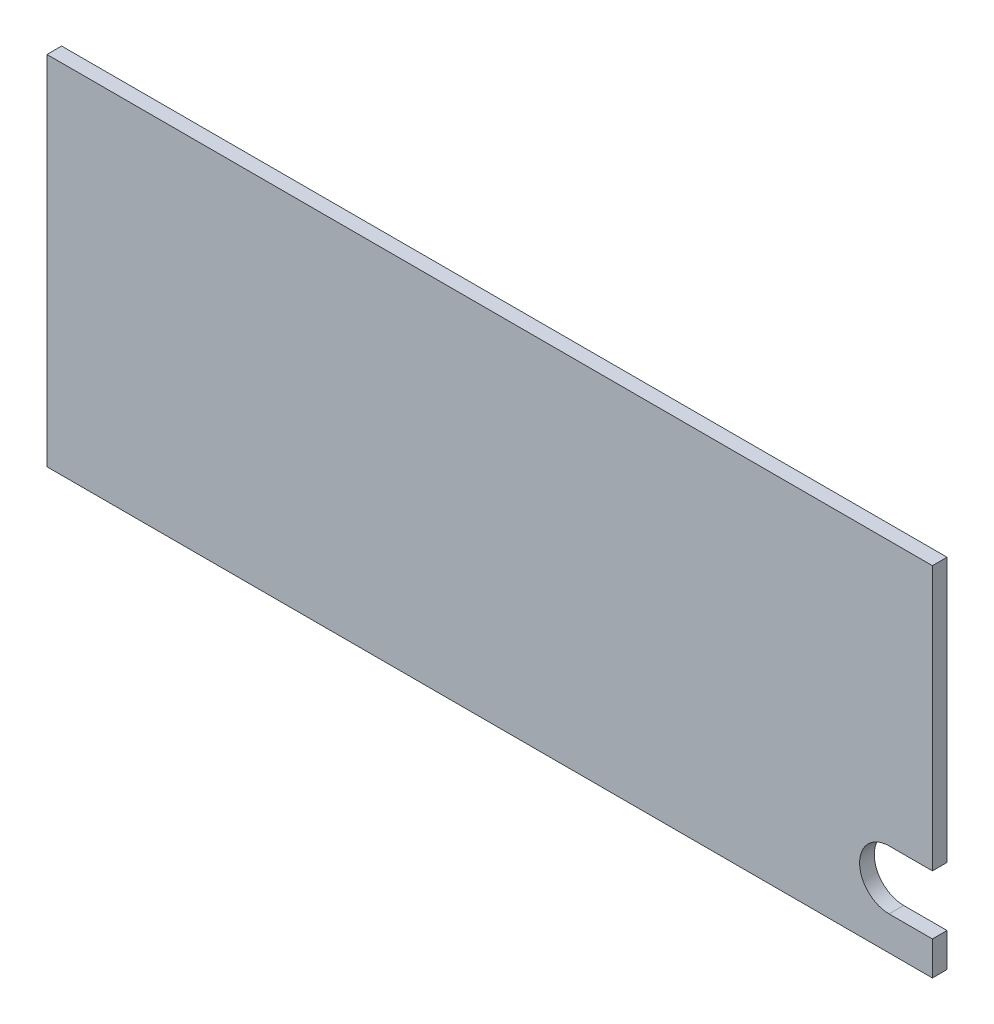
ISO-10303-21;
HEADER;
FILE_DESCRIPTION(('STEP AP214'),'2;1');
FILE_NAME('part.step','',(''),(''),'','','');
FILE_SCHEMA(('AUTOMOTIVE_DESIGN { 1 0 10303 214 1 1 1 1 }'));
ENDSEC;
DATA;
#1=APPLICATION_CONTEXT('core data for automotive mechanical design processes');
#2=APPLICATION_PROTOCOL_DEFINITION('international standard','automotive_design',2000,#1);
#3=PRODUCT_CONTEXT('',#1,'mechanical');
#4=PRODUCT('Part','Part','',(#3));
#5=PRODUCT_RELATED_PRODUCT_CATEGORY('part','',(#4));
#6=PRODUCT_DEFINITION_FORMATION('','',#4);
#7=PRODUCT_DEFINITION_CONTEXT('part definition',#1,'design');
#8=PRODUCT_DEFINITION('design','',#6,#7);
#9=PRODUCT_DEFINITION_SHAPE('','',#8);
#10=(LENGTH_UNIT() NAMED_UNIT(*) SI_UNIT(.MILLI.,.METRE.));
#11=(NAMED_UNIT(*) PLANE_ANGLE_UNIT() SI_UNIT($,.RADIAN.));
#12=(NAMED_UNIT(*) SI_UNIT($,.STERADIAN.) SOLID_ANGLE_UNIT());
#13=UNCERTAINTY_MEASURE_WITH_UNIT(LENGTH_MEASURE(1.E-05),#10,'distance_accuracy_value','');
#14=(GEOMETRIC_REPRESENTATION_CONTEXT(3) GLOBAL_UNCERTAINTY_ASSIGNED_CONTEXT((#13)) GLOBAL_UNIT_ASSIGNED_CONTEXT((#10,
#11,#12)) REPRESENTATION_CONTEXT('',''));
#15=CARTESIAN_POINT('',(0.,0.,0.));
#16=DIRECTION('',(0.,0.,1.));
#17=DIRECTION('',(1.,0.,0.));
#18=AXIS2_PLACEMENT_3D('',#15,#16,#17);
#19=CARTESIAN_POINT('',(121.,0.,2.));
#20=DIRECTION('',(-1.,0.,0.));
#21=DIRECTION('',(0.,0.,1.));
#22=AXIS2_PLACEMENT_3D('',#19,#20,#21);
#23=PLANE('',#22);
#24=DIRECTION('',(0.,1.,0.));
#25=VECTOR('',#24,1.);
#26=CARTESIAN_POINT('',(121.,0.,0.));
#27=LINE('',#26,#25);
#28=CARTESIAN_POINT('',(121.,0.,0.));
#29=VERTEX_POINT('',#28);
#30=CARTESIAN_POINT('',(121.,4.62293045559235,0.));
#31=VERTEX_POINT('',#30);
#32=EDGE_CURVE('E167',#29,#31,#27,.T.);
#33=ORIENTED_EDGE('',*,*,#32,.T.);
#34=DIRECTION('',(0.,0.,1.));
#35=VECTOR('',#34,1.);
#36=CARTESIAN_POINT('',(121.,4.62293045559235,2.));
#37=LINE('',#36,#35);
#38=CARTESIAN_POINT('',(121.,4.62293045559235,2.));
#39=VERTEX_POINT('',#38);
#40=EDGE_CURVE('E143',#31,#39,#37,.T.);
#41=ORIENTED_EDGE('',*,*,#40,.T.);
#42=DIRECTION('',(0.,1.,0.));
#43=VECTOR('',#42,1.);
#44=CARTESIAN_POINT('',(121.,0.,2.));
#45=LINE('',#44,#43);
#46=CARTESIAN_POINT('',(121.,0.,2.));
#47=VERTEX_POINT('',#46);
#48=EDGE_CURVE('E154',#47,#39,#45,.T.);
#49=ORIENTED_EDGE('',*,*,#48,.F.);
#50=DIRECTION('',(0.,0.,-1.));
#51=VECTOR('',#50,1.);
#52=CARTESIAN_POINT('',(121.,0.,2.));
#53=LINE('',#52,#51);
#54=EDGE_CURVE('E178',#47,#29,#53,.T.);
#55=ORIENTED_EDGE('',*,*,#54,.T.);
#56=EDGE_LOOP('',(#33,#41,#49,#55));
#57=FACE_BOUND('',#56,.T.);
#58=ADVANCED_FACE('F39',(#57),#23,.F.);
#59=CARTESIAN_POINT('',(0.,0.,2.));
#60=DIRECTION('',(1.,0.,0.));
#61=DIRECTION('',(0.,0.,-1.));
#62=AXIS2_PLACEMENT_3D('',#59,#60,#61);
#63=PLANE('',#62);
#64=DIRECTION('',(0.,-1.,0.));
#65=VECTOR('',#64,1.);
#66=CARTESIAN_POINT('',(0.,0.,0.));
#67=LINE('',#66,#65);
#68=CARTESIAN_POINT('',(0.,48.8,0.));
#69=VERTEX_POINT('',#68);
#70=CARTESIAN_POINT('',(0.,0.,0.));
#71=VERTEX_POINT('',#70);
#72=EDGE_CURVE('E147',#69,#71,#67,.T.);
#73=ORIENTED_EDGE('',*,*,#72,.T.);
#74=DIRECTION('',(0.,0.,-1.));
#75=VECTOR('',#74,1.);
#76=CARTESIAN_POINT('',(0.,0.,2.));
#77=LINE('',#76,#75);
#78=CARTESIAN_POINT('',(0.,0.,2.));
#79=VERTEX_POINT('',#78);
#80=EDGE_CURVE('E182',#79,#71,#77,.T.);
#81=ORIENTED_EDGE('',*,*,#80,.F.);
#82=DIRECTION('',(0.,-1.,0.));
#83=VECTOR('',#82,1.);
#84=CARTESIAN_POINT('',(0.,0.,2.));
#85=LINE('',#84,#83);
#86=CARTESIAN_POINT('',(0.,48.8,2.));
#87=VERTEX_POINT('',#86);
#88=EDGE_CURVE('E148',#87,#79,#85,.T.);
#89=ORIENTED_EDGE('',*,*,#88,.F.);
#90=DIRECTION('',(0.,0.,-1.));
#91=VECTOR('',#90,1.);
#92=CARTESIAN_POINT('',(0.,48.8,2.));
#93=LINE('',#92,#91);
#94=EDGE_CURVE('E159',#87,#69,#93,.T.);
#95=ORIENTED_EDGE('',*,*,#94,.T.);
#96=EDGE_LOOP('',(#73,#81,#89,#95));
#97=FACE_BOUND('',#96,.T.);
#98=ADVANCED_FACE('F41',(#97),#63,.F.);
#99=CARTESIAN_POINT('',(0.,0.,2.));
#100=DIRECTION('',(0.,1.,0.));
#101=DIRECTION('',(0.,0.,1.));
#102=AXIS2_PLACEMENT_3D('',#99,#100,#101);
#103=PLANE('',#102);
#104=DIRECTION('',(1.,0.,0.));
#105=VECTOR('',#104,1.);
#106=CARTESIAN_POINT('',(0.,0.,0.));
#107=LINE('',#106,#105);
#108=EDGE_CURVE('E163',#71,#29,#107,.T.);
#109=ORIENTED_EDGE('',*,*,#108,.T.);
#110=ORIENTED_EDGE('',*,*,#54,.F.);
#111=DIRECTION('',(1.,0.,0.));
#112=VECTOR('',#111,1.);
#113=CARTESIAN_POINT('',(0.,0.,2.));
#114=LINE('',#113,#112);
#115=EDGE_CURVE('E93',#79,#47,#114,.T.);
#116=ORIENTED_EDGE('',*,*,#115,.F.);
#117=ORIENTED_EDGE('',*,*,#80,.T.);
#118=EDGE_LOOP('',(#109,#110,#116,#117));
#119=FACE_BOUND('',#118,.T.);
#120=ADVANCED_FACE('F204',(#119),#103,.F.);
#121=CARTESIAN_POINT('',(121.,12.6737729249973,2.));
#122=VERTEX_POINT('',#121);
#123=CARTESIAN_POINT('',(121.,48.8,2.));
#124=VERTEX_POINT('',#123);
#125=EDGE_CURVE('E153',#122,#124,#45,.T.);
#126=ORIENTED_EDGE('',*,*,#125,.F.);
#127=DIRECTION('',(0.,0.,-1.));
#128=VECTOR('',#127,1.);
#129=CARTESIAN_POINT('',(121.,12.6737729249973,2.));
#130=LINE('',#129,#128);
#131=CARTESIAN_POINT('',(121.,12.6737729249973,0.));
#132=VERTEX_POINT('',#131);
#133=EDGE_CURVE('E128',#122,#132,#130,.T.);
#134=ORIENTED_EDGE('',*,*,#133,.T.);
#135=CARTESIAN_POINT('',(121.,48.8,0.));
#136=VERTEX_POINT('',#135);
#137=EDGE_CURVE('E166',#132,#136,#27,.T.);
#138=ORIENTED_EDGE('',*,*,#137,.T.);
#139=DIRECTION('',(0.,0.,-1.));
#140=VECTOR('',#139,1.);
#141=CARTESIAN_POINT('',(121.,48.8,2.));
#142=LINE('',#141,#140);
#143=EDGE_CURVE('E175',#124,#136,#142,.T.);
#144=ORIENTED_EDGE('',*,*,#143,.F.);
#145=EDGE_LOOP('',(#126,#134,#138,#144));
#146=FACE_BOUND('',#145,.T.);
#147=ADVANCED_FACE('F193',(#146),#23,.F.);
#148=CARTESIAN_POINT('',(0.,48.8,2.));
#149=DIRECTION('',(0.,-1.,0.));
#150=DIRECTION('',(0.,0.,-1.));
#151=AXIS2_PLACEMENT_3D('',#148,#149,#150);
#152=PLANE('',#151);
#153=DIRECTION('',(-1.,0.,0.));
#154=VECTOR('',#153,1.);
#155=CARTESIAN_POINT('',(0.,48.8,0.));
#156=LINE('',#155,#154);
#157=EDGE_CURVE('E85',#136,#69,#156,.T.);
#158=ORIENTED_EDGE('',*,*,#157,.T.);
#159=ORIENTED_EDGE('',*,*,#94,.F.);
#160=DIRECTION('',(-1.,0.,0.));
#161=VECTOR('',#160,1.);
#162=CARTESIAN_POINT('',(0.,48.8,2.));
#163=LINE('',#162,#161);
#164=EDGE_CURVE('E64',#124,#87,#163,.T.);
#165=ORIENTED_EDGE('',*,*,#164,.F.);
#166=ORIENTED_EDGE('',*,*,#143,.T.);
#167=EDGE_LOOP('',(#158,#159,#165,#166));
#168=FACE_BOUND('',#167,.T.);
#169=ADVANCED_FACE('F195',(#168),#152,.F.);
#170=CARTESIAN_POINT('',(0.,0.,2.));
#171=DIRECTION('',(0.,0.,-1.));
#172=DIRECTION('',(-1.,0.,0.));
#173=AXIS2_PLACEMENT_3D('',#170,#171,#172);
#174=PLANE('',#173);
#175=ORIENTED_EDGE('',*,*,#48,.T.);
#176=DIRECTION('',(1.,0.,0.));
#177=VECTOR('',#176,1.);
#178=CARTESIAN_POINT('',(126.922454277233,4.62293045559235,2.));
#179=LINE('',#178,#177);
#180=CARTESIAN_POINT('',(115.077545722767,4.62293045559235,2.));
#181=VERTEX_POINT('',#180);
#182=EDGE_CURVE('E122',#181,#39,#179,.T.);
#183=ORIENTED_EDGE('',*,*,#182,.F.);
#184=CARTESIAN_POINT('',(115.077545722767,8.6483516902948,2.));
#185=DIRECTION('',(0.,0.,1.));
#186=DIRECTION('',(1.,0.,0.));
#187=AXIS2_PLACEMENT_3D('',#184,#185,#186);
#188=CIRCLE('',#187,4.02542123470245);
#189=CARTESIAN_POINT('',(115.077545722767,12.6737729249973,2.));
#190=VERTEX_POINT('',#189);
#191=EDGE_CURVE('E116',#190,#181,#188,.T.);
#192=ORIENTED_EDGE('',*,*,#191,.F.);
#193=DIRECTION('',(-1.,0.,0.));
#194=VECTOR('',#193,1.);
#195=CARTESIAN_POINT('',(126.922454277233,12.6737729249973,2.));
#196=LINE('',#195,#194);
#197=EDGE_CURVE('E125',#122,#190,#196,.T.);
#198=ORIENTED_EDGE('',*,*,#197,.F.);
#199=ORIENTED_EDGE('',*,*,#125,.T.);
#200=ORIENTED_EDGE('',*,*,#164,.T.);
#201=ORIENTED_EDGE('',*,*,#88,.T.);
#202=ORIENTED_EDGE('',*,*,#115,.T.);
#203=EDGE_LOOP('',(#175,#183,#192,#198,#199,#200,#201,#202));
#204=FACE_BOUND('',#203,.T.);
#205=ADVANCED_FACE('F133',(#204),#174,.F.);
#206=CARTESIAN_POINT('',(0.,0.,0.));
#207=DIRECTION('',(0.,0.,-1.));
#208=DIRECTION('',(-1.,0.,0.));
#209=AXIS2_PLACEMENT_3D('',#206,#207,#208);
#210=PLANE('',#209);
#211=DIRECTION('',(-1.,0.,0.));
#212=VECTOR('',#211,1.);
#213=CARTESIAN_POINT('',(0.,4.62293045559235,0.));
#214=LINE('',#213,#212);
#215=CARTESIAN_POINT('',(115.077545722767,4.62293045559235,0.));
#216=VERTEX_POINT('',#215);
#217=EDGE_CURVE('E11',#31,#216,#214,.T.);
#218=ORIENTED_EDGE('',*,*,#217,.F.);
#219=ORIENTED_EDGE('',*,*,#32,.F.);
#220=ORIENTED_EDGE('',*,*,#108,.F.);
#221=ORIENTED_EDGE('',*,*,#72,.F.);
#222=ORIENTED_EDGE('',*,*,#157,.F.);
#223=ORIENTED_EDGE('',*,*,#137,.F.);
#224=DIRECTION('',(1.,0.,0.));
#225=VECTOR('',#224,1.);
#226=CARTESIAN_POINT('',(0.,12.6737729249973,0.));
#227=LINE('',#226,#225);
#228=CARTESIAN_POINT('',(115.077545722767,12.6737729249973,0.));
#229=VERTEX_POINT('',#228);
#230=EDGE_CURVE('E185',#229,#132,#227,.T.);
#231=ORIENTED_EDGE('',*,*,#230,.F.);
#232=CARTESIAN_POINT('',(115.077545722767,8.6483516902948,0.));
#233=DIRECTION('',(0.,0.,-1.));
#234=DIRECTION('',(-1.,0.,0.));
#235=AXIS2_PLACEMENT_3D('',#232,#233,#234);
#236=CIRCLE('',#235,4.02542123470245);
#237=EDGE_CURVE('E48',#216,#229,#236,.T.);
#238=ORIENTED_EDGE('',*,*,#237,.F.);
#239=EDGE_LOOP('',(#218,#219,#220,#221,#222,#223,#231,#238));
#240=FACE_BOUND('',#239,.T.);
#241=ADVANCED_FACE('F198',(#240),#210,.T.);
#242=CARTESIAN_POINT('',(126.922454277233,4.62293045559235,-10.));
#243=DIRECTION('',(0.,-1.,0.));
#244=DIRECTION('',(0.,0.,-1.));
#245=AXIS2_PLACEMENT_3D('',#242,#243,#244);
#246=PLANE('',#245);
#247=ORIENTED_EDGE('',*,*,#217,.T.);
#248=DIRECTION('',(0.,0.,1.));
#249=VECTOR('',#248,1.);
#250=CARTESIAN_POINT('',(115.077545722767,4.62293045559235,-10.));
#251=LINE('',#250,#249);
#252=EDGE_CURVE('E121',#216,#181,#251,.T.);
#253=ORIENTED_EDGE('',*,*,#252,.T.);
#254=ORIENTED_EDGE('',*,*,#182,.T.);
#255=ORIENTED_EDGE('',*,*,#40,.F.);
#256=EDGE_LOOP('',(#247,#253,#254,#255));
#257=FACE_BOUND('',#256,.T.);
#258=ADVANCED_FACE('F207',(#257),#246,.F.);
#259=CARTESIAN_POINT('',(126.922454277233,12.6737729249973,-10.));
#260=DIRECTION('',(0.,1.,0.));
#261=DIRECTION('',(0.,0.,1.));
#262=AXIS2_PLACEMENT_3D('',#259,#260,#261);
#263=PLANE('',#262);
#264=ORIENTED_EDGE('',*,*,#197,.T.);
#265=DIRECTION('',(0.,0.,1.));
#266=VECTOR('',#265,1.);
#267=CARTESIAN_POINT('',(115.077545722767,12.6737729249973,-10.));
#268=LINE('',#267,#266);
#269=EDGE_CURVE('E55',#229,#190,#268,.T.);
#270=ORIENTED_EDGE('',*,*,#269,.F.);
#271=ORIENTED_EDGE('',*,*,#230,.T.);
#272=ORIENTED_EDGE('',*,*,#133,.F.);
#273=EDGE_LOOP('',(#264,#270,#271,#272));
#274=FACE_BOUND('',#273,.T.);
#275=ADVANCED_FACE('F126',(#274),#263,.F.);
#276=CARTESIAN_POINT('',(115.077545722767,8.6483516902948,-10.));
#277=DIRECTION('',(0.,0.,1.));
#278=DIRECTION('',(1.,0.,0.));
#279=AXIS2_PLACEMENT_3D('',#276,#277,#278);
#280=CYLINDRICAL_SURFACE('',#279,4.02542123470245);
#281=ORIENTED_EDGE('',*,*,#237,.T.);
#282=ORIENTED_EDGE('',*,*,#269,.T.);
#283=ORIENTED_EDGE('',*,*,#191,.T.);
#284=ORIENTED_EDGE('',*,*,#252,.F.);
#285=EDGE_LOOP('',(#281,#282,#283,#284));
#286=FACE_BOUND('',#285,.T.);
#287=ADVANCED_FACE('F113',(#286),#280,.F.);
#288=CLOSED_SHELL('',(#58,#98,#120,#147,#169,#205,#241,#258,#275,#287));
#289=MANIFOLD_SOLID_BREP('B2',#288);
#290=ADVANCED_BREP_SHAPE_REPRESENTATION('',(#18,#289),#14);
#291=SHAPE_DEFINITION_REPRESENTATION(#9,#290);
ENDSEC;
END-ISO-10303-21;
